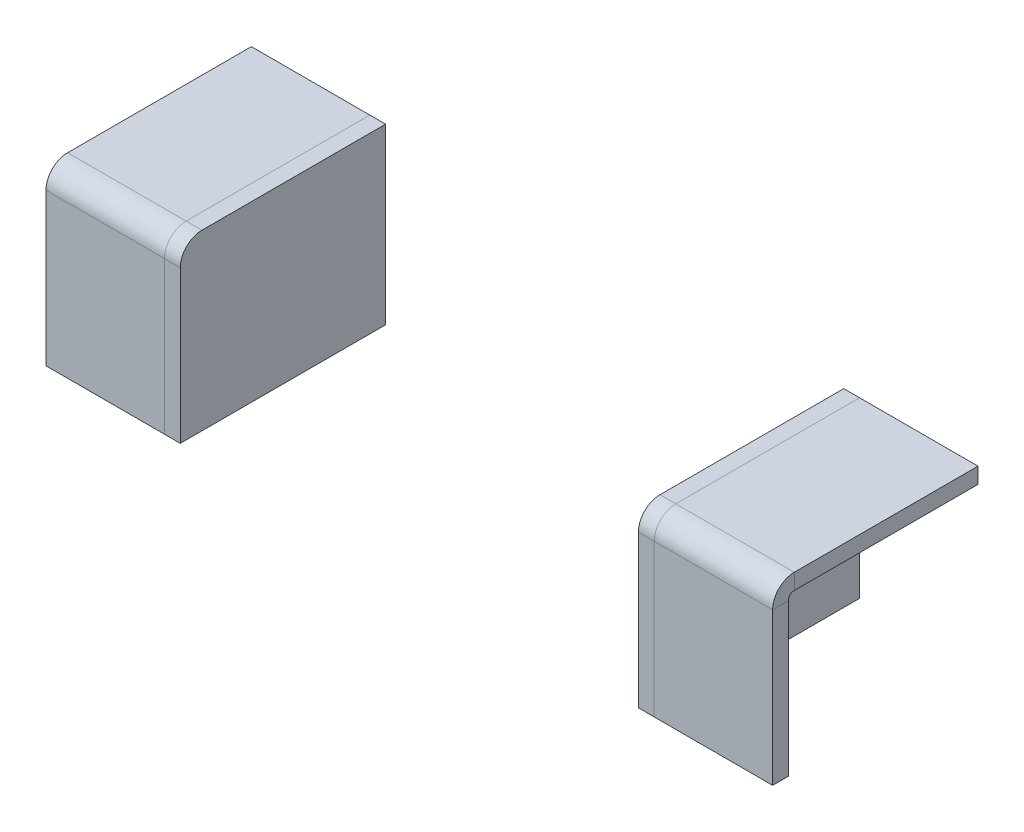
ISO-10303-21;
HEADER;
FILE_DESCRIPTION(('STEP AP214'),'2;1');
FILE_NAME('part.step','',(''),(''),'','','');
FILE_SCHEMA(('AUTOMOTIVE_DESIGN { 1 0 10303 214 1 1 1 1 }'));
ENDSEC;
DATA;
#1=APPLICATION_CONTEXT('core data for automotive mechanical design processes');
#2=APPLICATION_PROTOCOL_DEFINITION('international standard','automotive_design',2000,#1);
#3=PRODUCT_CONTEXT('',#1,'mechanical');
#4=PRODUCT('Part','Part','',(#3));
#5=PRODUCT_RELATED_PRODUCT_CATEGORY('part','',(#4));
#6=PRODUCT_DEFINITION_FORMATION('','',#4);
#7=PRODUCT_DEFINITION_CONTEXT('part definition',#1,'design');
#8=PRODUCT_DEFINITION('design','',#6,#7);
#9=PRODUCT_DEFINITION_SHAPE('','',#8);
#10=(LENGTH_UNIT() NAMED_UNIT(*) SI_UNIT(.MILLI.,.METRE.));
#11=(NAMED_UNIT(*) PLANE_ANGLE_UNIT() SI_UNIT($,.RADIAN.));
#12=(NAMED_UNIT(*) SI_UNIT($,.STERADIAN.) SOLID_ANGLE_UNIT());
#13=UNCERTAINTY_MEASURE_WITH_UNIT(LENGTH_MEASURE(1.E-05),#10,'distance_accuracy_value','');
#14=(GEOMETRIC_REPRESENTATION_CONTEXT(3) GLOBAL_UNCERTAINTY_ASSIGNED_CONTEXT((#13)) GLOBAL_UNIT_ASSIGNED_CONTEXT((#10,
#11,#12)) REPRESENTATION_CONTEXT('',''));
#15=CARTESIAN_POINT('',(0.,0.,0.));
#16=DIRECTION('',(0.,0.,1.));
#17=DIRECTION('',(1.,0.,0.));
#18=AXIS2_PLACEMENT_3D('',#15,#16,#17);
#19=CARTESIAN_POINT('',(67.5,-22.,13.0000000000001));
#20=DIRECTION('',(0.,1.,0.));
#21=DIRECTION('',(0.,0.,1.));
#22=AXIS2_PLACEMENT_3D('',#19,#20,#21);
#23=PLANE('',#22);
#24=DIRECTION('',(0.,0.,-1.));
#25=VECTOR('',#24,1.);
#26=CARTESIAN_POINT('',(69.5,-22.,13.0000000000001));
#27=LINE('',#26,#25);
#28=CARTESIAN_POINT('',(69.5,-22.,13.0000000000001));
#29=VERTEX_POINT('',#28);
#30=CARTESIAN_POINT('',(69.5,-22.,-13.));
#31=VERTEX_POINT('',#30);
#32=EDGE_CURVE('E146',#29,#31,#27,.T.);
#33=ORIENTED_EDGE('',*,*,#32,.F.);
#34=DIRECTION('',(1.,0.,0.));
#35=VECTOR('',#34,1.);
#36=CARTESIAN_POINT('',(67.5,-22.,13.0000000000001));
#37=LINE('',#36,#35);
#38=CARTESIAN_POINT('',(67.5,-22.,13.0000000000001));
#39=VERTEX_POINT('',#38);
#40=EDGE_CURVE('E145',#39,#29,#37,.T.);
#41=ORIENTED_EDGE('',*,*,#40,.F.);
#42=DIRECTION('',(0.,0.,-1.));
#43=VECTOR('',#42,1.);
#44=CARTESIAN_POINT('',(67.5,-22.,13.0000000000001));
#45=LINE('',#44,#43);
#46=CARTESIAN_POINT('',(67.5,-22.,-13.));
#47=VERTEX_POINT('',#46);
#48=EDGE_CURVE('E140',#39,#47,#45,.T.);
#49=ORIENTED_EDGE('',*,*,#48,.T.);
#50=DIRECTION('',(1.,0.,0.));
#51=VECTOR('',#50,1.);
#52=CARTESIAN_POINT('',(67.5,-22.,-13.));
#53=LINE('',#52,#51);
#54=EDGE_CURVE('E14',#47,#31,#53,.T.);
#55=ORIENTED_EDGE('',*,*,#54,.T.);
#56=EDGE_LOOP('',(#33,#41,#49,#55));
#57=FACE_BOUND('',#56,.T.);
#58=ADVANCED_FACE('F71',(#57),#23,.F.);
#59=CARTESIAN_POINT('',(67.5,-22.,-13.));
#60=DIRECTION('',(0.,0.,1.));
#61=DIRECTION('',(-1.,0.,0.));
#62=AXIS2_PLACEMENT_3D('',#59,#60,#61);
#63=PLANE('',#62);
#64=DIRECTION('',(0.,1.,0.));
#65=VECTOR('',#64,1.);
#66=CARTESIAN_POINT('',(69.5,-22.,-13.));
#67=LINE('',#66,#65);
#68=CARTESIAN_POINT('',(69.5,0.,-13.));
#69=VERTEX_POINT('',#68);
#70=EDGE_CURVE('E148',#31,#69,#67,.T.);
#71=ORIENTED_EDGE('',*,*,#70,.F.);
#72=ORIENTED_EDGE('',*,*,#54,.F.);
#73=DIRECTION('',(0.,1.,0.));
#74=VECTOR('',#73,1.);
#75=CARTESIAN_POINT('',(67.5,-22.,-13.));
#76=LINE('',#75,#74);
#77=CARTESIAN_POINT('',(67.5,0.,-13.));
#78=VERTEX_POINT('',#77);
#79=EDGE_CURVE('E116',#47,#78,#76,.T.);
#80=ORIENTED_EDGE('',*,*,#79,.T.);
#81=DIRECTION('',(1.,0.,0.));
#82=VECTOR('',#81,1.);
#83=CARTESIAN_POINT('',(67.5,0.,-13.));
#84=LINE('',#83,#82);
#85=EDGE_CURVE('E79',#78,#69,#84,.T.);
#86=ORIENTED_EDGE('',*,*,#85,.T.);
#87=EDGE_LOOP('',(#71,#72,#80,#86));
#88=FACE_BOUND('',#87,.T.);
#89=ADVANCED_FACE('F157',(#88),#63,.F.);
#90=CARTESIAN_POINT('',(67.5,0.,10.2634));
#91=DIRECTION('',(0.,-1.,0.));
#92=DIRECTION('',(0.,0.,-1.));
#93=AXIS2_PLACEMENT_3D('',#90,#91,#92);
#94=PLANE('',#93);
#95=DIRECTION('',(0.,0.,1.));
#96=VECTOR('',#95,1.);
#97=CARTESIAN_POINT('',(69.5,0.,10.2634));
#98=LINE('',#97,#96);
#99=CARTESIAN_POINT('',(69.5,0.,10.2634));
#100=VERTEX_POINT('',#99);
#101=EDGE_CURVE('E151',#69,#100,#98,.T.);
#102=ORIENTED_EDGE('',*,*,#101,.F.);
#103=ORIENTED_EDGE('',*,*,#85,.F.);
#104=DIRECTION('',(0.,0.,1.));
#105=VECTOR('',#104,1.);
#106=CARTESIAN_POINT('',(67.5,0.,10.2634));
#107=LINE('',#106,#105);
#108=CARTESIAN_POINT('',(67.5,0.,10.2634));
#109=VERTEX_POINT('',#108);
#110=EDGE_CURVE('E125',#78,#109,#107,.T.);
#111=ORIENTED_EDGE('',*,*,#110,.T.);
#112=DIRECTION('',(1.,0.,0.));
#113=VECTOR('',#112,1.);
#114=CARTESIAN_POINT('',(67.5,0.,10.2634));
#115=LINE('',#114,#113);
#116=EDGE_CURVE('E130',#109,#100,#115,.T.);
#117=ORIENTED_EDGE('',*,*,#116,.T.);
#118=EDGE_LOOP('',(#102,#103,#111,#117));
#119=FACE_BOUND('',#118,.T.);
#120=ADVANCED_FACE('F137',(#119),#94,.F.);
#121=CARTESIAN_POINT('',(67.5,-2.7366,10.2634));
#122=DIRECTION('',(1.,0.,0.));
#123=DIRECTION('',(0.,0.,1.));
#124=AXIS2_PLACEMENT_3D('',#121,#122,#123);
#125=CYLINDRICAL_SURFACE('',#124,2.7366);
#126=CARTESIAN_POINT('',(69.5,-2.7366,10.2634));
#127=DIRECTION('',(1.,0.,0.));
#128=DIRECTION('',(0.,0.,-1.));
#129=AXIS2_PLACEMENT_3D('',#126,#127,#128);
#130=CIRCLE('',#129,2.7366);
#131=CARTESIAN_POINT('',(69.5,-2.73659999999999,13.));
#132=VERTEX_POINT('',#131);
#133=EDGE_CURVE('E132',#100,#132,#130,.T.);
#134=ORIENTED_EDGE('',*,*,#133,.F.);
#135=ORIENTED_EDGE('',*,*,#116,.F.);
#136=CARTESIAN_POINT('',(67.5,-2.7366,10.2634));
#137=DIRECTION('',(1.,0.,0.));
#138=DIRECTION('',(0.,0.,-1.));
#139=AXIS2_PLACEMENT_3D('',#136,#137,#138);
#140=CIRCLE('',#139,2.7366);
#141=CARTESIAN_POINT('',(67.5,-2.73659999999999,13.));
#142=VERTEX_POINT('',#141);
#143=EDGE_CURVE('E121',#109,#142,#140,.T.);
#144=ORIENTED_EDGE('',*,*,#143,.T.);
#145=DIRECTION('',(1.,0.,0.));
#146=VECTOR('',#145,1.);
#147=CARTESIAN_POINT('',(67.5,-2.73659999999999,13.));
#148=LINE('',#147,#146);
#149=EDGE_CURVE('E135',#142,#132,#148,.T.);
#150=ORIENTED_EDGE('',*,*,#149,.T.);
#151=EDGE_LOOP('',(#134,#135,#144,#150));
#152=FACE_BOUND('',#151,.T.);
#153=ADVANCED_FACE('F131',(#152),#125,.T.);
#154=CARTESIAN_POINT('',(67.5,-22.,13.0000000000001));
#155=DIRECTION('',(0.,0.,-1.));
#156=DIRECTION('',(0.,1.,0.));
#157=AXIS2_PLACEMENT_3D('',#154,#155,#156);
#158=PLANE('',#157);
#159=DIRECTION('',(0.,-1.,0.));
#160=VECTOR('',#159,1.);
#161=CARTESIAN_POINT('',(69.5,-22.,13.0000000000001));
#162=LINE('',#161,#160);
#163=EDGE_CURVE('E104',#132,#29,#162,.T.);
#164=ORIENTED_EDGE('',*,*,#163,.F.);
#165=ORIENTED_EDGE('',*,*,#149,.F.);
#166=DIRECTION('',(0.,-1.,0.));
#167=VECTOR('',#166,1.);
#168=CARTESIAN_POINT('',(67.5,-22.,13.0000000000001));
#169=LINE('',#168,#167);
#170=EDGE_CURVE('E87',#142,#39,#169,.T.);
#171=ORIENTED_EDGE('',*,*,#170,.T.);
#172=ORIENTED_EDGE('',*,*,#40,.T.);
#173=EDGE_LOOP('',(#164,#165,#171,#172));
#174=FACE_BOUND('',#173,.T.);
#175=ADVANCED_FACE('F163',(#174),#158,.F.);
#176=CARTESIAN_POINT('',(67.5,-2.7366,10.2634));
#177=DIRECTION('',(-1.,0.,0.));
#178=DIRECTION('',(0.,0.,-1.));
#179=AXIS2_PLACEMENT_3D('',#176,#177,#178);
#180=PLANE('',#179);
#181=ORIENTED_EDGE('',*,*,#48,.F.);
#182=ORIENTED_EDGE('',*,*,#170,.F.);
#183=ORIENTED_EDGE('',*,*,#143,.F.);
#184=ORIENTED_EDGE('',*,*,#110,.F.);
#185=ORIENTED_EDGE('',*,*,#79,.F.);
#186=EDGE_LOOP('',(#181,#182,#183,#184,#185));
#187=FACE_BOUND('',#186,.T.);
#188=ADVANCED_FACE('F123',(#187),#180,.T.);
#189=CARTESIAN_POINT('',(69.5,-2.7366,10.2634));
#190=DIRECTION('',(-1.,0.,0.));
#191=DIRECTION('',(0.,0.,-1.));
#192=AXIS2_PLACEMENT_3D('',#189,#190,#191);
#193=PLANE('',#192);
#194=ORIENTED_EDGE('',*,*,#32,.T.);
#195=ORIENTED_EDGE('',*,*,#70,.T.);
#196=ORIENTED_EDGE('',*,*,#101,.T.);
#197=ORIENTED_EDGE('',*,*,#133,.T.);
#198=ORIENTED_EDGE('',*,*,#163,.T.);
#199=EDGE_LOOP('',(#194,#195,#196,#197,#198));
#200=FACE_BOUND('',#199,.T.);
#201=ADVANCED_FACE('F158',(#200),#193,.F.);
#202=CLOSED_SHELL('',(#58,#89,#120,#153,#175,#188,#201));
#203=MANIFOLD_SOLID_BREP('B2',#202);
#204=CARTESIAN_POINT('',(84.5,-2.,13.));
#205=DIRECTION('',(1.,0.,0.));
#206=DIRECTION('',(0.,0.,1.));
#207=AXIS2_PLACEMENT_3D('',#204,#205,#206);
#208=PLANE('',#207);
#209=DIRECTION('',(0.,0.,1.));
#210=VECTOR('',#209,1.);
#211=CARTESIAN_POINT('',(84.5,-2.,13.));
#212=LINE('',#211,#210);
#213=CARTESIAN_POINT('',(84.5,-2.,-13.));
#214=VERTEX_POINT('',#213);
#215=CARTESIAN_POINT('',(84.5,-2.,10.2634));
#216=VERTEX_POINT('',#215);
#217=EDGE_CURVE('E379',#214,#216,#212,.T.);
#218=ORIENTED_EDGE('',*,*,#217,.F.);
#219=DIRECTION('',(0.,1.,0.));
#220=VECTOR('',#219,1.);
#221=CARTESIAN_POINT('',(84.5,-2.,-13.));
#222=LINE('',#221,#220);
#223=CARTESIAN_POINT('',(84.5,0.,-13.));
#224=VERTEX_POINT('',#223);
#225=EDGE_CURVE('E69',#214,#224,#222,.T.);
#226=ORIENTED_EDGE('',*,*,#225,.T.);
#227=DIRECTION('',(0.,0.,1.));
#228=VECTOR('',#227,1.);
#229=CARTESIAN_POINT('',(84.5,0.,13.));
#230=LINE('',#229,#228);
#231=CARTESIAN_POINT('',(84.5,0.,10.2634));
#232=VERTEX_POINT('',#231);
#233=EDGE_CURVE('E377',#224,#232,#230,.T.);
#234=ORIENTED_EDGE('',*,*,#233,.T.);
#235=DIRECTION('',(0.,1.,0.));
#236=VECTOR('',#235,1.);
#237=CARTESIAN_POINT('',(84.5,-2.,10.2634));
#238=LINE('',#237,#236);
#239=EDGE_CURVE('E361',#216,#232,#238,.T.);
#240=ORIENTED_EDGE('',*,*,#239,.F.);
#241=EDGE_LOOP('',(#218,#226,#234,#240));
#242=FACE_BOUND('',#241,.T.);
#243=ADVANCED_FACE('F244',(#242),#208,.T.);
#244=CARTESIAN_POINT('',(77.,-2.,0.));
#245=DIRECTION('',(0.,-1.,0.));
#246=DIRECTION('',(0.,0.,-1.));
#247=AXIS2_PLACEMENT_3D('',#244,#245,#246);
#248=PLANE('',#247);
#249=DIRECTION('',(0.,0.,-1.));
#250=VECTOR('',#249,1.);
#251=CARTESIAN_POINT('',(69.5,-2.,13.));
#252=LINE('',#251,#250);
#253=CARTESIAN_POINT('',(69.5,-2.,10.2634));
#254=VERTEX_POINT('',#253);
#255=CARTESIAN_POINT('',(69.5,-2.,-13.));
#256=VERTEX_POINT('',#255);
#257=EDGE_CURVE('E373',#254,#256,#252,.T.);
#258=ORIENTED_EDGE('',*,*,#257,.T.);
#259=DIRECTION('',(1.,0.,0.));
#260=VECTOR('',#259,1.);
#261=CARTESIAN_POINT('',(84.5,-2.,-13.));
#262=LINE('',#261,#260);
#263=EDGE_CURVE('E376',#256,#214,#262,.T.);
#264=ORIENTED_EDGE('',*,*,#263,.T.);
#265=ORIENTED_EDGE('',*,*,#217,.T.);
#266=DIRECTION('',(1.,0.,0.));
#267=VECTOR('',#266,1.);
#268=CARTESIAN_POINT('',(84.5,-2.,10.2634));
#269=LINE('',#268,#267);
#270=EDGE_CURVE('E364',#216,#254,#269,.F.);
#271=ORIENTED_EDGE('',*,*,#270,.T.);
#272=EDGE_LOOP('',(#258,#264,#265,#271));
#273=FACE_BOUND('',#272,.T.);
#274=ADVANCED_FACE('F411',(#273),#248,.T.);
#275=CARTESIAN_POINT('',(77.,0.,0.));
#276=DIRECTION('',(0.,-1.,0.));
#277=DIRECTION('',(0.,0.,-1.));
#278=AXIS2_PLACEMENT_3D('',#275,#276,#277);
#279=PLANE('',#278);
#280=DIRECTION('',(1.,0.,0.));
#281=VECTOR('',#280,1.);
#282=CARTESIAN_POINT('',(84.5,0.,10.2634));
#283=LINE('',#282,#281);
#284=CARTESIAN_POINT('',(69.5,0.,10.2634));
#285=VERTEX_POINT('',#284);
#286=EDGE_CURVE('E355',#232,#285,#283,.F.);
#287=ORIENTED_EDGE('',*,*,#286,.F.);
#288=ORIENTED_EDGE('',*,*,#233,.F.);
#289=DIRECTION('',(1.,0.,0.));
#290=VECTOR('',#289,1.);
#291=CARTESIAN_POINT('',(84.5,0.,-13.));
#292=LINE('',#291,#290);
#293=CARTESIAN_POINT('',(69.5,0.,-13.));
#294=VERTEX_POINT('',#293);
#295=EDGE_CURVE('E384',#294,#224,#292,.T.);
#296=ORIENTED_EDGE('',*,*,#295,.F.);
#297=DIRECTION('',(0.,0.,-1.));
#298=VECTOR('',#297,1.);
#299=CARTESIAN_POINT('',(69.5,0.,13.));
#300=LINE('',#299,#298);
#301=EDGE_CURVE('E371',#285,#294,#300,.T.);
#302=ORIENTED_EDGE('',*,*,#301,.F.);
#303=EDGE_LOOP('',(#287,#288,#296,#302));
#304=FACE_BOUND('',#303,.T.);
#305=ADVANCED_FACE('F395',(#304),#279,.F.);
#306=CARTESIAN_POINT('',(69.5,-2.,13.));
#307=DIRECTION('',(-1.,0.,0.));
#308=DIRECTION('',(0.,0.,-1.));
#309=AXIS2_PLACEMENT_3D('',#306,#307,#308);
#310=PLANE('',#309);
#311=DIRECTION('',(0.,1.,0.));
#312=VECTOR('',#311,1.);
#313=CARTESIAN_POINT('',(69.5,-2.,10.2634));
#314=LINE('',#313,#312);
#315=EDGE_CURVE('E368',#254,#285,#314,.T.);
#316=ORIENTED_EDGE('',*,*,#315,.T.);
#317=ORIENTED_EDGE('',*,*,#301,.T.);
#318=DIRECTION('',(0.,1.,0.));
#319=VECTOR('',#318,1.);
#320=CARTESIAN_POINT('',(69.5,-2.,-13.));
#321=LINE('',#320,#319);
#322=EDGE_CURVE('E248',#256,#294,#321,.T.);
#323=ORIENTED_EDGE('',*,*,#322,.F.);
#324=ORIENTED_EDGE('',*,*,#257,.F.);
#325=EDGE_LOOP('',(#316,#317,#323,#324));
#326=FACE_BOUND('',#325,.T.);
#327=ADVANCED_FACE('F246',(#326),#310,.T.);
#328=CARTESIAN_POINT('',(84.5,-2.,-13.));
#329=DIRECTION('',(0.,0.,-1.));
#330=DIRECTION('',(1.,0.,0.));
#331=AXIS2_PLACEMENT_3D('',#328,#329,#330);
#332=PLANE('',#331);
#333=ORIENTED_EDGE('',*,*,#295,.T.);
#334=ORIENTED_EDGE('',*,*,#225,.F.);
#335=ORIENTED_EDGE('',*,*,#263,.F.);
#336=ORIENTED_EDGE('',*,*,#322,.T.);
#337=EDGE_LOOP('',(#333,#334,#335,#336));
#338=FACE_BOUND('',#337,.T.);
#339=ADVANCED_FACE('F414',(#338),#332,.T.);
#340=CARTESIAN_POINT('',(69.5,-2.7366,10.2634));
#341=DIRECTION('',(-1.,0.,0.));
#342=DIRECTION('',(0.,0.,-1.));
#343=AXIS2_PLACEMENT_3D('',#340,#341,#342);
#344=PLANE('',#343);
#345=DIRECTION('',(0.,0.,-1.));
#346=VECTOR('',#345,1.);
#347=CARTESIAN_POINT('',(69.5,-2.7366,13.));
#348=LINE('',#347,#346);
#349=CARTESIAN_POINT('',(69.5,-2.73659999999999,11.));
#350=VERTEX_POINT('',#349);
#351=CARTESIAN_POINT('',(69.5,-2.73659999999999,13.));
#352=VERTEX_POINT('',#351);
#353=EDGE_CURVE('E352',#350,#352,#348,.F.);
#354=ORIENTED_EDGE('',*,*,#353,.T.);
#355=CARTESIAN_POINT('',(69.5,-2.7366,10.2634));
#356=DIRECTION('',(-1.,0.,0.));
#357=DIRECTION('',(0.,0.,1.));
#358=AXIS2_PLACEMENT_3D('',#355,#356,#357);
#359=CIRCLE('',#358,2.7366);
#360=EDGE_CURVE('E358',#285,#352,#359,.F.);
#361=ORIENTED_EDGE('',*,*,#360,.F.);
#362=ORIENTED_EDGE('',*,*,#315,.F.);
#363=CARTESIAN_POINT('',(69.5,-2.7366,10.2634));
#364=DIRECTION('',(-1.,0.,0.));
#365=DIRECTION('',(0.,0.,1.));
#366=AXIS2_PLACEMENT_3D('',#363,#364,#365);
#367=CIRCLE('',#366,0.7366);
#368=EDGE_CURVE('E266',#254,#350,#367,.F.);
#369=ORIENTED_EDGE('',*,*,#368,.T.);
#370=EDGE_LOOP('',(#354,#361,#362,#369));
#371=FACE_BOUND('',#370,.T.);
#372=ADVANCED_FACE('F407',(#371),#344,.T.);
#373=CARTESIAN_POINT('',(84.5,-2.7366,10.2634));
#374=DIRECTION('',(-1.,0.,0.));
#375=DIRECTION('',(0.,0.,-1.));
#376=AXIS2_PLACEMENT_3D('',#373,#374,#375);
#377=PLANE('',#376);
#378=CARTESIAN_POINT('',(84.5,-2.7366,10.2634));
#379=DIRECTION('',(-1.,0.,0.));
#380=DIRECTION('',(0.,0.,1.));
#381=AXIS2_PLACEMENT_3D('',#378,#379,#380);
#382=CIRCLE('',#381,0.7366);
#383=CARTESIAN_POINT('',(84.5,-2.73659999999999,11.));
#384=VERTEX_POINT('',#383);
#385=EDGE_CURVE('E259',#384,#216,#382,.T.);
#386=ORIENTED_EDGE('',*,*,#385,.T.);
#387=ORIENTED_EDGE('',*,*,#239,.T.);
#388=CARTESIAN_POINT('',(84.5,-2.7366,10.2634));
#389=DIRECTION('',(-1.,0.,0.));
#390=DIRECTION('',(0.,0.,1.));
#391=AXIS2_PLACEMENT_3D('',#388,#389,#390);
#392=CIRCLE('',#391,2.7366);
#393=CARTESIAN_POINT('',(84.5,-2.7366,13.));
#394=VERTEX_POINT('',#393);
#395=EDGE_CURVE('E359',#394,#232,#392,.T.);
#396=ORIENTED_EDGE('',*,*,#395,.F.);
#397=DIRECTION('',(0.,0.,-1.));
#398=VECTOR('',#397,1.);
#399=CARTESIAN_POINT('',(84.5,-2.7366,11.));
#400=LINE('',#399,#398);
#401=EDGE_CURVE('E346',#384,#394,#400,.F.);
#402=ORIENTED_EDGE('',*,*,#401,.F.);
#403=EDGE_LOOP('',(#386,#387,#396,#402));
#404=FACE_BOUND('',#403,.T.);
#405=ADVANCED_FACE('F399',(#404),#377,.F.);
#406=CARTESIAN_POINT('',(84.5,-2.7366,10.2634));
#407=DIRECTION('',(1.,0.,0.));
#408=DIRECTION('',(0.,0.,1.));
#409=AXIS2_PLACEMENT_3D('',#406,#407,#408);
#410=CYLINDRICAL_SURFACE('',#409,2.7366);
#411=ORIENTED_EDGE('',*,*,#286,.T.);
#412=ORIENTED_EDGE('',*,*,#360,.T.);
#413=DIRECTION('',(1.,0.,0.));
#414=VECTOR('',#413,1.);
#415=CARTESIAN_POINT('',(69.5,-2.7366,13.));
#416=LINE('',#415,#414);
#417=EDGE_CURVE('E328',#394,#352,#416,.F.);
#418=ORIENTED_EDGE('',*,*,#417,.F.);
#419=ORIENTED_EDGE('',*,*,#395,.T.);
#420=EDGE_LOOP('',(#411,#412,#418,#419));
#421=FACE_BOUND('',#420,.T.);
#422=ADVANCED_FACE('F400',(#421),#410,.T.);
#423=CARTESIAN_POINT('',(84.5,-2.7366,10.2634));
#424=DIRECTION('',(1.,0.,0.));
#425=DIRECTION('',(0.,0.,1.));
#426=AXIS2_PLACEMENT_3D('',#423,#424,#425);
#427=CYLINDRICAL_SURFACE('',#426,0.7366);
#428=ORIENTED_EDGE('',*,*,#270,.F.);
#429=ORIENTED_EDGE('',*,*,#385,.F.);
#430=DIRECTION('',(1.,0.,0.));
#431=VECTOR('',#430,1.);
#432=CARTESIAN_POINT('',(69.5,-2.7366,11.));
#433=LINE('',#432,#431);
#434=EDGE_CURVE('E349',#350,#384,#433,.T.);
#435=ORIENTED_EDGE('',*,*,#434,.F.);
#436=ORIENTED_EDGE('',*,*,#368,.F.);
#437=EDGE_LOOP('',(#428,#429,#435,#436));
#438=FACE_BOUND('',#437,.T.);
#439=ADVANCED_FACE('F405',(#438),#427,.F.);
#440=CARTESIAN_POINT('',(84.5,-22.,13.0000000000001));
#441=DIRECTION('',(-1.,0.,0.));
#442=DIRECTION('',(0.,1.,0.));
#443=AXIS2_PLACEMENT_3D('',#440,#441,#442);
#444=PLANE('',#443);
#445=ORIENTED_EDGE('',*,*,#401,.T.);
#446=DIRECTION('',(0.,-1.,0.));
#447=VECTOR('',#446,1.);
#448=CARTESIAN_POINT('',(84.5,0.,13.));
#449=LINE('',#448,#447);
#450=CARTESIAN_POINT('',(84.5,-22.,13.0000000000001));
#451=VERTEX_POINT('',#450);
#452=EDGE_CURVE('E323',#394,#451,#449,.T.);
#453=ORIENTED_EDGE('',*,*,#452,.T.);
#454=DIRECTION('',(0.,0.,-1.));
#455=VECTOR('',#454,1.);
#456=CARTESIAN_POINT('',(84.5,-22.,13.0000000000001));
#457=LINE('',#456,#455);
#458=CARTESIAN_POINT('',(84.5,-22.,11.0000000000001));
#459=VERTEX_POINT('',#458);
#460=EDGE_CURVE('E319',#451,#459,#457,.T.);
#461=ORIENTED_EDGE('',*,*,#460,.T.);
#462=DIRECTION('',(0.,1.,0.));
#463=VECTOR('',#462,1.);
#464=CARTESIAN_POINT('',(84.5,-22.,11.0000000000001));
#465=LINE('',#464,#463);
#466=EDGE_CURVE('E342',#384,#459,#465,.F.);
#467=ORIENTED_EDGE('',*,*,#466,.F.);
#468=EDGE_LOOP('',(#445,#453,#461,#467));
#469=FACE_BOUND('',#468,.T.);
#470=ADVANCED_FACE('F402',(#469),#444,.F.);
#471=CARTESIAN_POINT('',(69.5,-1.99999999999999,13.));
#472=DIRECTION('',(1.,0.,0.));
#473=DIRECTION('',(0.,0.,1.));
#474=AXIS2_PLACEMENT_3D('',#471,#472,#473);
#475=PLANE('',#474);
#476=ORIENTED_EDGE('',*,*,#353,.F.);
#477=DIRECTION('',(0.,-1.,0.));
#478=VECTOR('',#477,1.);
#479=CARTESIAN_POINT('',(69.5,-2.,11.));
#480=LINE('',#479,#478);
#481=CARTESIAN_POINT('',(69.5,-22.,11.0000000000001));
#482=VERTEX_POINT('',#481);
#483=EDGE_CURVE('E334',#482,#350,#480,.F.);
#484=ORIENTED_EDGE('',*,*,#483,.F.);
#485=DIRECTION('',(0.,0.,-1.));
#486=VECTOR('',#485,1.);
#487=CARTESIAN_POINT('',(69.5,-22.,13.0000000000001));
#488=LINE('',#487,#486);
#489=CARTESIAN_POINT('',(69.5,-22.,13.0000000000001));
#490=VERTEX_POINT('',#489);
#491=EDGE_CURVE('E316',#490,#482,#488,.T.);
#492=ORIENTED_EDGE('',*,*,#491,.F.);
#493=DIRECTION('',(0.,1.,0.));
#494=VECTOR('',#493,1.);
#495=CARTESIAN_POINT('',(69.5,0.,13.));
#496=LINE('',#495,#494);
#497=EDGE_CURVE('E322',#490,#352,#496,.T.);
#498=ORIENTED_EDGE('',*,*,#497,.T.);
#499=EDGE_LOOP('',(#476,#484,#492,#498));
#500=FACE_BOUND('',#499,.T.);
#501=ADVANCED_FACE('F333',(#500),#475,.F.);
#502=CARTESIAN_POINT('',(77.,0.,13.));
#503=DIRECTION('',(0.,0.,-1.));
#504=DIRECTION('',(0.,1.,0.));
#505=AXIS2_PLACEMENT_3D('',#502,#503,#504);
#506=PLANE('',#505);
#507=ORIENTED_EDGE('',*,*,#417,.T.);
#508=ORIENTED_EDGE('',*,*,#497,.F.);
#509=DIRECTION('',(-1.,0.,0.));
#510=VECTOR('',#509,1.);
#511=CARTESIAN_POINT('',(77.,-22.,13.0000000000001));
#512=LINE('',#511,#510);
#513=EDGE_CURVE('E312',#451,#490,#512,.T.);
#514=ORIENTED_EDGE('',*,*,#513,.F.);
#515=ORIENTED_EDGE('',*,*,#452,.F.);
#516=EDGE_LOOP('',(#507,#508,#514,#515));
#517=FACE_BOUND('',#516,.T.);
#518=ADVANCED_FACE('F326',(#517),#506,.F.);
#519=CARTESIAN_POINT('',(77.,0.,11.));
#520=DIRECTION('',(0.,0.,-1.));
#521=DIRECTION('',(0.,1.,0.));
#522=AXIS2_PLACEMENT_3D('',#519,#520,#521);
#523=PLANE('',#522);
#524=ORIENTED_EDGE('',*,*,#466,.T.);
#525=DIRECTION('',(1.,0.,0.));
#526=VECTOR('',#525,1.);
#527=CARTESIAN_POINT('',(69.5,-22.,11.0000000000001));
#528=LINE('',#527,#526);
#529=EDGE_CURVE('E340',#459,#482,#528,.F.);
#530=ORIENTED_EDGE('',*,*,#529,.T.);
#531=ORIENTED_EDGE('',*,*,#483,.T.);
#532=ORIENTED_EDGE('',*,*,#434,.T.);
#533=EDGE_LOOP('',(#524,#530,#531,#532));
#534=FACE_BOUND('',#533,.T.);
#535=ADVANCED_FACE('F404',(#534),#523,.T.);
#536=CARTESIAN_POINT('',(69.5,-22.,13.0000000000001));
#537=DIRECTION('',(0.,1.,0.));
#538=DIRECTION('',(0.,0.,1.));
#539=AXIS2_PLACEMENT_3D('',#536,#537,#538);
#540=PLANE('',#539);
#541=ORIENTED_EDGE('',*,*,#529,.F.);
#542=ORIENTED_EDGE('',*,*,#460,.F.);
#543=ORIENTED_EDGE('',*,*,#513,.T.);
#544=ORIENTED_EDGE('',*,*,#491,.T.);
#545=EDGE_LOOP('',(#541,#542,#543,#544));
#546=FACE_BOUND('',#545,.T.);
#547=ADVANCED_FACE('F314',(#546),#540,.F.);
#548=CLOSED_SHELL('',(#243,#274,#305,#327,#339,#372,#405,#422,#439,#470,#501,#518,#535,#547));
#549=MANIFOLD_SOLID_BREP('B8',#548);
#550=CARTESIAN_POINT('',(9.5,-22.,13.0000000000001));
#551=DIRECTION('',(0.,1.,0.));
#552=DIRECTION('',(0.,0.,1.));
#553=AXIS2_PLACEMENT_3D('',#550,#551,#552);
#554=PLANE('',#553);
#555=DIRECTION('',(0.,0.,-1.));
#556=VECTOR('',#555,1.);
#557=CARTESIAN_POINT('',(7.5,-22.,13.0000000000001));
#558=LINE('',#557,#556);
#559=CARTESIAN_POINT('',(7.5,-22.,13.0000000000001));
#560=VERTEX_POINT('',#559);
#561=CARTESIAN_POINT('',(7.5,-22.,-13.));
#562=VERTEX_POINT('',#561);
#563=EDGE_CURVE('E638',#560,#562,#558,.T.);
#564=ORIENTED_EDGE('',*,*,#563,.T.);
#565=DIRECTION('',(-1.,0.,0.));
#566=VECTOR('',#565,1.);
#567=CARTESIAN_POINT('',(9.5,-22.,-13.));
#568=LINE('',#567,#566);
#569=CARTESIAN_POINT('',(9.5,-22.,-13.));
#570=VERTEX_POINT('',#569);
#571=EDGE_CURVE('E242',#570,#562,#568,.T.);
#572=ORIENTED_EDGE('',*,*,#571,.F.);
#573=DIRECTION('',(0.,0.,-1.));
#574=VECTOR('',#573,1.);
#575=CARTESIAN_POINT('',(9.5,-22.,13.0000000000001));
#576=LINE('',#575,#574);
#577=CARTESIAN_POINT('',(9.5,-22.,13.0000000000001));
#578=VERTEX_POINT('',#577);
#579=EDGE_CURVE('E646',#578,#570,#576,.T.);
#580=ORIENTED_EDGE('',*,*,#579,.F.);
#581=DIRECTION('',(-1.,0.,0.));
#582=VECTOR('',#581,1.);
#583=CARTESIAN_POINT('',(9.5,-22.,13.0000000000001));
#584=LINE('',#583,#582);
#585=EDGE_CURVE('E634',#578,#560,#584,.T.);
#586=ORIENTED_EDGE('',*,*,#585,.T.);
#587=EDGE_LOOP('',(#564,#572,#580,#586));
#588=FACE_BOUND('',#587,.T.);
#589=ADVANCED_FACE('F564',(#588),#554,.F.);
#590=CARTESIAN_POINT('',(9.5,-22.,-13.));
#591=DIRECTION('',(0.,0.,1.));
#592=DIRECTION('',(1.,0.,0.));
#593=AXIS2_PLACEMENT_3D('',#590,#591,#592);
#594=PLANE('',#593);
#595=DIRECTION('',(0.,1.,0.));
#596=VECTOR('',#595,1.);
#597=CARTESIAN_POINT('',(7.5,-22.,-13.));
#598=LINE('',#597,#596);
#599=CARTESIAN_POINT('',(7.5,0.,-13.));
#600=VERTEX_POINT('',#599);
#601=EDGE_CURVE('E641',#562,#600,#598,.T.);
#602=ORIENTED_EDGE('',*,*,#601,.T.);
#603=DIRECTION('',(-1.,0.,0.));
#604=VECTOR('',#603,1.);
#605=CARTESIAN_POINT('',(9.5,0.,-13.));
#606=LINE('',#605,#604);
#607=CARTESIAN_POINT('',(9.5,0.,-13.));
#608=VERTEX_POINT('',#607);
#609=EDGE_CURVE('E572',#608,#600,#606,.T.);
#610=ORIENTED_EDGE('',*,*,#609,.F.);
#611=DIRECTION('',(0.,1.,0.));
#612=VECTOR('',#611,1.);
#613=CARTESIAN_POINT('',(9.5,-22.,-13.));
#614=LINE('',#613,#612);
#615=EDGE_CURVE('E614',#570,#608,#614,.T.);
#616=ORIENTED_EDGE('',*,*,#615,.F.);
#617=ORIENTED_EDGE('',*,*,#571,.T.);
#618=EDGE_LOOP('',(#602,#610,#616,#617));
#619=FACE_BOUND('',#618,.T.);
#620=ADVANCED_FACE('F665',(#619),#594,.F.);
#621=CARTESIAN_POINT('',(9.5,0.,10.2634));
#622=DIRECTION('',(0.,-1.,0.));
#623=DIRECTION('',(0.,0.,-1.));
#624=AXIS2_PLACEMENT_3D('',#621,#622,#623);
#625=PLANE('',#624);
#626=DIRECTION('',(0.,0.,1.));
#627=VECTOR('',#626,1.);
#628=CARTESIAN_POINT('',(7.5,0.,10.2634));
#629=LINE('',#628,#627);
#630=CARTESIAN_POINT('',(7.5,0.,10.2634));
#631=VERTEX_POINT('',#630);
#632=EDGE_CURVE('E629',#600,#631,#629,.T.);
#633=ORIENTED_EDGE('',*,*,#632,.T.);
#634=DIRECTION('',(-1.,0.,0.));
#635=VECTOR('',#634,1.);
#636=CARTESIAN_POINT('',(9.5,0.,10.2634));
#637=LINE('',#636,#635);
#638=CARTESIAN_POINT('',(9.5,0.,10.2634));
#639=VERTEX_POINT('',#638);
#640=EDGE_CURVE('E626',#639,#631,#637,.T.);
#641=ORIENTED_EDGE('',*,*,#640,.F.);
#642=DIRECTION('',(0.,0.,1.));
#643=VECTOR('',#642,1.);
#644=CARTESIAN_POINT('',(9.5,0.,10.2634));
#645=LINE('',#644,#643);
#646=EDGE_CURVE('E618',#608,#639,#645,.T.);
#647=ORIENTED_EDGE('',*,*,#646,.F.);
#648=ORIENTED_EDGE('',*,*,#609,.T.);
#649=EDGE_LOOP('',(#633,#641,#647,#648));
#650=FACE_BOUND('',#649,.T.);
#651=ADVANCED_FACE('F627',(#650),#625,.F.);
#652=CARTESIAN_POINT('',(9.5,-2.7366,10.2634));
#653=DIRECTION('',(-1.,0.,0.));
#654=DIRECTION('',(0.,0.,1.));
#655=AXIS2_PLACEMENT_3D('',#652,#653,#654);
#656=CYLINDRICAL_SURFACE('',#655,2.7366);
#657=CARTESIAN_POINT('',(7.5,-2.7366,10.2634));
#658=DIRECTION('',(1.,0.,0.));
#659=DIRECTION('',(0.,0.,-1.));
#660=AXIS2_PLACEMENT_3D('',#657,#658,#659);
#661=CIRCLE('',#660,2.7366);
#662=CARTESIAN_POINT('',(7.5,-2.73659999999999,13.));
#663=VERTEX_POINT('',#662);
#664=EDGE_CURVE('E600',#631,#663,#661,.T.);
#665=ORIENTED_EDGE('',*,*,#664,.T.);
#666=DIRECTION('',(-1.,0.,0.));
#667=VECTOR('',#666,1.);
#668=CARTESIAN_POINT('',(9.5,-2.73659999999999,13.));
#669=LINE('',#668,#667);
#670=CARTESIAN_POINT('',(9.5,-2.73659999999999,13.));
#671=VERTEX_POINT('',#670);
#672=EDGE_CURVE('E630',#671,#663,#669,.T.);
#673=ORIENTED_EDGE('',*,*,#672,.F.);
#674=CARTESIAN_POINT('',(9.5,-2.7366,10.2634));
#675=DIRECTION('',(1.,0.,0.));
#676=DIRECTION('',(0.,0.,-1.));
#677=AXIS2_PLACEMENT_3D('',#674,#675,#676);
#678=CIRCLE('',#677,2.7366);
#679=EDGE_CURVE('E622',#639,#671,#678,.T.);
#680=ORIENTED_EDGE('',*,*,#679,.F.);
#681=ORIENTED_EDGE('',*,*,#640,.T.);
#682=EDGE_LOOP('',(#665,#673,#680,#681));
#683=FACE_BOUND('',#682,.T.);
#684=ADVANCED_FACE('F632',(#683),#656,.T.);
#685=CARTESIAN_POINT('',(9.5,-22.,13.0000000000001));
#686=DIRECTION('',(0.,0.,-1.));
#687=DIRECTION('',(0.,1.,0.));
#688=AXIS2_PLACEMENT_3D('',#685,#686,#687);
#689=PLANE('',#688);
#690=DIRECTION('',(0.,-1.,0.));
#691=VECTOR('',#690,1.);
#692=CARTESIAN_POINT('',(7.5,-22.,13.0000000000001));
#693=LINE('',#692,#691);
#694=EDGE_CURVE('E606',#663,#560,#693,.T.);
#695=ORIENTED_EDGE('',*,*,#694,.T.);
#696=ORIENTED_EDGE('',*,*,#585,.F.);
#697=DIRECTION('',(0.,-1.,0.));
#698=VECTOR('',#697,1.);
#699=CARTESIAN_POINT('',(9.5,-22.,13.0000000000001));
#700=LINE('',#699,#698);
#701=EDGE_CURVE('E580',#671,#578,#700,.T.);
#702=ORIENTED_EDGE('',*,*,#701,.F.);
#703=ORIENTED_EDGE('',*,*,#672,.T.);
#704=EDGE_LOOP('',(#695,#696,#702,#703));
#705=FACE_BOUND('',#704,.T.);
#706=ADVANCED_FACE('F654',(#705),#689,.F.);
#707=CARTESIAN_POINT('',(9.5,-2.7366,10.2634));
#708=DIRECTION('',(1.,0.,0.));
#709=DIRECTION('',(0.,0.,-1.));
#710=AXIS2_PLACEMENT_3D('',#707,#708,#709);
#711=PLANE('',#710);
#712=ORIENTED_EDGE('',*,*,#579,.T.);
#713=ORIENTED_EDGE('',*,*,#615,.T.);
#714=ORIENTED_EDGE('',*,*,#646,.T.);
#715=ORIENTED_EDGE('',*,*,#679,.T.);
#716=ORIENTED_EDGE('',*,*,#701,.T.);
#717=EDGE_LOOP('',(#712,#713,#714,#715,#716));
#718=FACE_BOUND('',#717,.T.);
#719=ADVANCED_FACE('F620',(#718),#711,.T.);
#720=CARTESIAN_POINT('',(7.5,-2.7366,10.2634));
#721=DIRECTION('',(1.,0.,0.));
#722=DIRECTION('',(0.,0.,-1.));
#723=AXIS2_PLACEMENT_3D('',#720,#721,#722);
#724=PLANE('',#723);
#725=ORIENTED_EDGE('',*,*,#563,.F.);
#726=ORIENTED_EDGE('',*,*,#694,.F.);
#727=ORIENTED_EDGE('',*,*,#664,.F.);
#728=ORIENTED_EDGE('',*,*,#632,.F.);
#729=ORIENTED_EDGE('',*,*,#601,.F.);
#730=EDGE_LOOP('',(#725,#726,#727,#728,#729));
#731=FACE_BOUND('',#730,.T.);
#732=ADVANCED_FACE('F650',(#731),#724,.F.);
#733=CLOSED_SHELL('',(#589,#620,#651,#684,#706,#719,#732));
#734=MANIFOLD_SOLID_BREP('B63',#733);
#735=CARTESIAN_POINT('',(-7.5,-2.,13.));
#736=DIRECTION('',(-1.,0.,0.));
#737=DIRECTION('',(0.,0.,1.));
#738=AXIS2_PLACEMENT_3D('',#735,#736,#737);
#739=PLANE('',#738);
#740=DIRECTION('',(0.,0.,1.));
#741=VECTOR('',#740,1.);
#742=CARTESIAN_POINT('',(-7.5,-2.,13.));
#743=LINE('',#742,#741);
#744=CARTESIAN_POINT('',(-7.5,-2.,-13.));
#745=VERTEX_POINT('',#744);
#746=CARTESIAN_POINT('',(-7.5,-2.,10.2634));
#747=VERTEX_POINT('',#746);
#748=EDGE_CURVE('E860',#745,#747,#743,.T.);
#749=ORIENTED_EDGE('',*,*,#748,.T.);
#750=DIRECTION('',(0.,1.,0.));
#751=VECTOR('',#750,1.);
#752=CARTESIAN_POINT('',(-7.5,-2.,10.2634));
#753=LINE('',#752,#751);
#754=CARTESIAN_POINT('',(-7.5,0.,10.2634));
#755=VERTEX_POINT('',#754);
#756=EDGE_CURVE('E841',#747,#755,#753,.T.);
#757=ORIENTED_EDGE('',*,*,#756,.T.);
#758=DIRECTION('',(0.,0.,1.));
#759=VECTOR('',#758,1.);
#760=CARTESIAN_POINT('',(-7.5,0.,13.));
#761=LINE('',#760,#759);
#762=CARTESIAN_POINT('',(-7.5,0.,-13.));
#763=VERTEX_POINT('',#762);
#764=EDGE_CURVE('E857',#763,#755,#761,.T.);
#765=ORIENTED_EDGE('',*,*,#764,.F.);
#766=DIRECTION('',(0.,1.,0.));
#767=VECTOR('',#766,1.);
#768=CARTESIAN_POINT('',(-7.5,-2.,-13.));
#769=LINE('',#768,#767);
#770=EDGE_CURVE('E562',#745,#763,#769,.T.);
#771=ORIENTED_EDGE('',*,*,#770,.F.);
#772=EDGE_LOOP('',(#749,#757,#765,#771));
#773=FACE_BOUND('',#772,.T.);
#774=ADVANCED_FACE('F727',(#773),#739,.T.);
#775=CARTESIAN_POINT('',(0.,-2.,0.));
#776=DIRECTION('',(0.,-1.,0.));
#777=DIRECTION('',(0.,0.,-1.));
#778=AXIS2_PLACEMENT_3D('',#775,#776,#777);
#779=PLANE('',#778);
#780=DIRECTION('',(0.,0.,-1.));
#781=VECTOR('',#780,1.);
#782=CARTESIAN_POINT('',(7.5,-2.,13.));
#783=LINE('',#782,#781);
#784=CARTESIAN_POINT('',(7.5,-2.,10.2634));
#785=VERTEX_POINT('',#784);
#786=CARTESIAN_POINT('',(7.5,-2.,-13.));
#787=VERTEX_POINT('',#786);
#788=EDGE_CURVE('E854',#785,#787,#783,.T.);
#789=ORIENTED_EDGE('',*,*,#788,.F.);
#790=DIRECTION('',(-1.,0.,0.));
#791=VECTOR('',#790,1.);
#792=CARTESIAN_POINT('',(-7.5,-2.,10.2634));
#793=LINE('',#792,#791);
#794=EDGE_CURVE('E742',#747,#785,#793,.F.);
#795=ORIENTED_EDGE('',*,*,#794,.F.);
#796=ORIENTED_EDGE('',*,*,#748,.F.);
#797=DIRECTION('',(-1.,0.,0.));
#798=VECTOR('',#797,1.);
#799=CARTESIAN_POINT('',(-7.5,-2.,-13.));
#800=LINE('',#799,#798);
#801=EDGE_CURVE('E856',#787,#745,#800,.T.);
#802=ORIENTED_EDGE('',*,*,#801,.F.);
#803=EDGE_LOOP('',(#789,#795,#796,#802));
#804=FACE_BOUND('',#803,.T.);
#805=ADVANCED_FACE('F903',(#804),#779,.T.);
#806=CARTESIAN_POINT('',(0.,0.,0.));
#807=DIRECTION('',(0.,-1.,0.));
#808=DIRECTION('',(0.,0.,-1.));
#809=AXIS2_PLACEMENT_3D('',#806,#807,#808);
#810=PLANE('',#809);
#811=DIRECTION('',(-1.,0.,0.));
#812=VECTOR('',#811,1.);
#813=CARTESIAN_POINT('',(-7.5,0.,10.2634));
#814=LINE('',#813,#812);
#815=CARTESIAN_POINT('',(7.5,0.,10.2634));
#816=VERTEX_POINT('',#815);
#817=EDGE_CURVE('E835',#755,#816,#814,.F.);
#818=ORIENTED_EDGE('',*,*,#817,.T.);
#819=DIRECTION('',(0.,0.,-1.));
#820=VECTOR('',#819,1.);
#821=CARTESIAN_POINT('',(7.5,0.,13.));
#822=LINE('',#821,#820);
#823=CARTESIAN_POINT('',(7.5,0.,-13.));
#824=VERTEX_POINT('',#823);
#825=EDGE_CURVE('E852',#816,#824,#822,.T.);
#826=ORIENTED_EDGE('',*,*,#825,.T.);
#827=DIRECTION('',(-1.,0.,0.));
#828=VECTOR('',#827,1.);
#829=CARTESIAN_POINT('',(-7.5,0.,-13.));
#830=LINE('',#829,#828);
#831=EDGE_CURVE('E863',#824,#763,#830,.T.);
#832=ORIENTED_EDGE('',*,*,#831,.T.);
#833=ORIENTED_EDGE('',*,*,#764,.T.);
#834=EDGE_LOOP('',(#818,#826,#832,#833));
#835=FACE_BOUND('',#834,.T.);
#836=ADVANCED_FACE('F870',(#835),#810,.F.);
#837=CARTESIAN_POINT('',(7.5,-2.,13.));
#838=DIRECTION('',(1.,0.,0.));
#839=DIRECTION('',(0.,0.,-1.));
#840=AXIS2_PLACEMENT_3D('',#837,#838,#839);
#841=PLANE('',#840);
#842=DIRECTION('',(0.,1.,0.));
#843=VECTOR('',#842,1.);
#844=CARTESIAN_POINT('',(7.5,-2.,10.2634));
#845=LINE('',#844,#843);
#846=EDGE_CURVE('E750',#785,#816,#845,.T.);
#847=ORIENTED_EDGE('',*,*,#846,.F.);
#848=ORIENTED_EDGE('',*,*,#788,.T.);
#849=DIRECTION('',(0.,1.,0.));
#850=VECTOR('',#849,1.);
#851=CARTESIAN_POINT('',(7.5,-2.,-13.));
#852=LINE('',#851,#850);
#853=EDGE_CURVE('E731',#787,#824,#852,.T.);
#854=ORIENTED_EDGE('',*,*,#853,.T.);
#855=ORIENTED_EDGE('',*,*,#825,.F.);
#856=EDGE_LOOP('',(#847,#848,#854,#855));
#857=FACE_BOUND('',#856,.T.);
#858=ADVANCED_FACE('F729',(#857),#841,.T.);
#859=CARTESIAN_POINT('',(-7.5,-2.,-13.));
#860=DIRECTION('',(0.,0.,-1.));
#861=DIRECTION('',(-1.,0.,0.));
#862=AXIS2_PLACEMENT_3D('',#859,#860,#861);
#863=PLANE('',#862);
#864=ORIENTED_EDGE('',*,*,#831,.F.);
#865=ORIENTED_EDGE('',*,*,#853,.F.);
#866=ORIENTED_EDGE('',*,*,#801,.T.);
#867=ORIENTED_EDGE('',*,*,#770,.T.);
#868=EDGE_LOOP('',(#864,#865,#866,#867));
#869=FACE_BOUND('',#868,.T.);
#870=ADVANCED_FACE('F893',(#869),#863,.T.);
#871=CARTESIAN_POINT('',(7.5,-2.7366,10.2634));
#872=DIRECTION('',(1.,0.,0.));
#873=DIRECTION('',(0.,0.,-1.));
#874=AXIS2_PLACEMENT_3D('',#871,#872,#873);
#875=PLANE('',#874);
#876=DIRECTION('',(0.,0.,-1.));
#877=VECTOR('',#876,1.);
#878=CARTESIAN_POINT('',(7.5,-2.7366,13.));
#879=LINE('',#878,#877);
#880=CARTESIAN_POINT('',(7.5,-2.73659999999999,11.));
#881=VERTEX_POINT('',#880);
#882=CARTESIAN_POINT('',(7.5,-2.73659999999999,13.));
#883=VERTEX_POINT('',#882);
#884=EDGE_CURVE('E817',#881,#883,#879,.F.);
#885=ORIENTED_EDGE('',*,*,#884,.F.);
#886=CARTESIAN_POINT('',(7.5,-2.7366,10.2634));
#887=DIRECTION('',(-1.,0.,0.));
#888=DIRECTION('',(0.,0.,1.));
#889=AXIS2_PLACEMENT_3D('',#886,#887,#888);
#890=CIRCLE('',#889,0.7366);
#891=EDGE_CURVE('E844',#785,#881,#890,.F.);
#892=ORIENTED_EDGE('',*,*,#891,.F.);
#893=ORIENTED_EDGE('',*,*,#846,.T.);
#894=CARTESIAN_POINT('',(7.5,-2.7366,10.2634));
#895=DIRECTION('',(-1.,0.,0.));
#896=DIRECTION('',(0.,0.,1.));
#897=AXIS2_PLACEMENT_3D('',#894,#895,#896);
#898=CIRCLE('',#897,2.7366);
#899=EDGE_CURVE('E837',#816,#883,#898,.F.);
#900=ORIENTED_EDGE('',*,*,#899,.T.);
#901=EDGE_LOOP('',(#885,#892,#893,#900));
#902=FACE_BOUND('',#901,.T.);
#903=ADVANCED_FACE('F891',(#902),#875,.T.);
#904=CARTESIAN_POINT('',(-7.5,-2.7366,10.2634));
#905=DIRECTION('',(1.,0.,0.));
#906=DIRECTION('',(0.,0.,-1.));
#907=AXIS2_PLACEMENT_3D('',#904,#905,#906);
#908=PLANE('',#907);
#909=CARTESIAN_POINT('',(-7.5,-2.7366,10.2634));
#910=DIRECTION('',(-1.,0.,0.));
#911=DIRECTION('',(0.,0.,1.));
#912=AXIS2_PLACEMENT_3D('',#909,#910,#911);
#913=CIRCLE('',#912,0.7366);
#914=CARTESIAN_POINT('',(-7.5,-2.73659999999999,11.));
#915=VERTEX_POINT('',#914);
#916=EDGE_CURVE('E848',#915,#747,#913,.T.);
#917=ORIENTED_EDGE('',*,*,#916,.F.);
#918=DIRECTION('',(0.,0.,-1.));
#919=VECTOR('',#918,1.);
#920=CARTESIAN_POINT('',(-7.5,-2.7366,11.));
#921=LINE('',#920,#919);
#922=CARTESIAN_POINT('',(-7.5,-2.7366,13.));
#923=VERTEX_POINT('',#922);
#924=EDGE_CURVE('E829',#915,#923,#921,.F.);
#925=ORIENTED_EDGE('',*,*,#924,.T.);
#926=CARTESIAN_POINT('',(-7.5,-2.7366,10.2634));
#927=DIRECTION('',(-1.,0.,0.));
#928=DIRECTION('',(0.,0.,1.));
#929=AXIS2_PLACEMENT_3D('',#926,#927,#928);
#930=CIRCLE('',#929,2.7366);
#931=EDGE_CURVE('E838',#923,#755,#930,.T.);
#932=ORIENTED_EDGE('',*,*,#931,.T.);
#933=ORIENTED_EDGE('',*,*,#756,.F.);
#934=EDGE_LOOP('',(#917,#925,#932,#933));
#935=FACE_BOUND('',#934,.T.);
#936=ADVANCED_FACE('F879',(#935),#908,.F.);
#937=CARTESIAN_POINT('',(-7.5,-2.7366,10.2634));
#938=DIRECTION('',(-1.,0.,0.));
#939=DIRECTION('',(0.,0.,1.));
#940=AXIS2_PLACEMENT_3D('',#937,#938,#939);
#941=CYLINDRICAL_SURFACE('',#940,2.7366);
#942=ORIENTED_EDGE('',*,*,#817,.F.);
#943=ORIENTED_EDGE('',*,*,#931,.F.);
#944=DIRECTION('',(-1.,0.,0.));
#945=VECTOR('',#944,1.);
#946=CARTESIAN_POINT('',(7.5,-2.7366,13.));
#947=LINE('',#946,#945);
#948=EDGE_CURVE('E827',#923,#883,#947,.F.);
#949=ORIENTED_EDGE('',*,*,#948,.T.);
#950=ORIENTED_EDGE('',*,*,#899,.F.);
#951=EDGE_LOOP('',(#942,#943,#949,#950));
#952=FACE_BOUND('',#951,.T.);
#953=ADVANCED_FACE('F875',(#952),#941,.T.);
#954=CARTESIAN_POINT('',(-7.5,-2.7366,10.2634));
#955=DIRECTION('',(-1.,0.,0.));
#956=DIRECTION('',(0.,0.,1.));
#957=AXIS2_PLACEMENT_3D('',#954,#955,#956);
#958=CYLINDRICAL_SURFACE('',#957,0.7366);
#959=ORIENTED_EDGE('',*,*,#794,.T.);
#960=ORIENTED_EDGE('',*,*,#891,.T.);
#961=DIRECTION('',(-1.,0.,0.));
#962=VECTOR('',#961,1.);
#963=CARTESIAN_POINT('',(7.5,-2.7366,11.));
#964=LINE('',#963,#962);
#965=EDGE_CURVE('E832',#881,#915,#964,.T.);
#966=ORIENTED_EDGE('',*,*,#965,.T.);
#967=ORIENTED_EDGE('',*,*,#916,.T.);
#968=EDGE_LOOP('',(#959,#960,#966,#967));
#969=FACE_BOUND('',#968,.T.);
#970=ADVANCED_FACE('F888',(#969),#958,.F.);
#971=CARTESIAN_POINT('',(-7.5,-22.,13.0000000000001));
#972=DIRECTION('',(1.,0.,0.));
#973=DIRECTION('',(0.,1.,0.));
#974=AXIS2_PLACEMENT_3D('',#971,#972,#973);
#975=PLANE('',#974);
#976=ORIENTED_EDGE('',*,*,#924,.F.);
#977=DIRECTION('',(0.,1.,0.));
#978=VECTOR('',#977,1.);
#979=CARTESIAN_POINT('',(-7.5,-22.,11.0000000000001));
#980=LINE('',#979,#978);
#981=CARTESIAN_POINT('',(-7.5,-22.,11.0000000000001));
#982=VERTEX_POINT('',#981);
#983=EDGE_CURVE('E825',#915,#982,#980,.F.);
#984=ORIENTED_EDGE('',*,*,#983,.T.);
#985=DIRECTION('',(0.,0.,-1.));
#986=VECTOR('',#985,1.);
#987=CARTESIAN_POINT('',(-7.5,-22.,13.0000000000001));
#988=LINE('',#987,#986);
#989=CARTESIAN_POINT('',(-7.5,-22.,13.0000000000001));
#990=VERTEX_POINT('',#989);
#991=EDGE_CURVE('E813',#990,#982,#988,.T.);
#992=ORIENTED_EDGE('',*,*,#991,.F.);
#993=DIRECTION('',(0.,-1.,0.));
#994=VECTOR('',#993,1.);
#995=CARTESIAN_POINT('',(-7.5,0.,13.));
#996=LINE('',#995,#994);
#997=EDGE_CURVE('E800',#923,#990,#996,.T.);
#998=ORIENTED_EDGE('',*,*,#997,.F.);
#999=EDGE_LOOP('',(#976,#984,#992,#998));
#1000=FACE_BOUND('',#999,.T.);
#1001=ADVANCED_FACE('F883',(#1000),#975,.F.);
#1002=CARTESIAN_POINT('',(7.5,-1.99999999999999,13.));
#1003=DIRECTION('',(-1.,0.,0.));
#1004=DIRECTION('',(0.,0.,1.));
#1005=AXIS2_PLACEMENT_3D('',#1002,#1003,#1004);
#1006=PLANE('',#1005);
#1007=ORIENTED_EDGE('',*,*,#884,.T.);
#1008=DIRECTION('',(0.,1.,0.));
#1009=VECTOR('',#1008,1.);
#1010=CARTESIAN_POINT('',(7.5,0.,13.));
#1011=LINE('',#1010,#1009);
#1012=CARTESIAN_POINT('',(7.5,-22.,13.0000000000001));
#1013=VERTEX_POINT('',#1012);
#1014=EDGE_CURVE('E798',#1013,#883,#1011,.T.);
#1015=ORIENTED_EDGE('',*,*,#1014,.F.);
#1016=DIRECTION('',(0.,0.,-1.));
#1017=VECTOR('',#1016,1.);
#1018=CARTESIAN_POINT('',(7.5,-22.,13.0000000000001));
#1019=LINE('',#1018,#1017);
#1020=CARTESIAN_POINT('',(7.5,-22.,11.0000000000001));
#1021=VERTEX_POINT('',#1020);
#1022=EDGE_CURVE('E806',#1013,#1021,#1019,.T.);
#1023=ORIENTED_EDGE('',*,*,#1022,.T.);
#1024=DIRECTION('',(0.,-1.,0.));
#1025=VECTOR('',#1024,1.);
#1026=CARTESIAN_POINT('',(7.5,-2.,11.));
#1027=LINE('',#1026,#1025);
#1028=EDGE_CURVE('E822',#1021,#881,#1027,.F.);
#1029=ORIENTED_EDGE('',*,*,#1028,.T.);
#1030=EDGE_LOOP('',(#1007,#1015,#1023,#1029));
#1031=FACE_BOUND('',#1030,.T.);
#1032=ADVANCED_FACE('F816',(#1031),#1006,.F.);
#1033=CARTESIAN_POINT('',(0.,0.,13.));
#1034=DIRECTION('',(0.,0.,-1.));
#1035=DIRECTION('',(0.,1.,0.));
#1036=AXIS2_PLACEMENT_3D('',#1033,#1034,#1035);
#1037=PLANE('',#1036);
#1038=ORIENTED_EDGE('',*,*,#948,.F.);
#1039=ORIENTED_EDGE('',*,*,#997,.T.);
#1040=DIRECTION('',(1.,0.,0.));
#1041=VECTOR('',#1040,1.);
#1042=CARTESIAN_POINT('',(0.,-22.,13.0000000000001));
#1043=LINE('',#1042,#1041);
#1044=EDGE_CURVE('E793',#990,#1013,#1043,.T.);
#1045=ORIENTED_EDGE('',*,*,#1044,.T.);
#1046=ORIENTED_EDGE('',*,*,#1014,.T.);
#1047=EDGE_LOOP('',(#1038,#1039,#1045,#1046));
#1048=FACE_BOUND('',#1047,.T.);
#1049=ADVANCED_FACE('F796',(#1048),#1037,.F.);
#1050=CARTESIAN_POINT('',(0.,0.,11.));
#1051=DIRECTION('',(0.,0.,-1.));
#1052=DIRECTION('',(0.,1.,0.));
#1053=AXIS2_PLACEMENT_3D('',#1050,#1051,#1052);
#1054=PLANE('',#1053);
#1055=ORIENTED_EDGE('',*,*,#983,.F.);
#1056=ORIENTED_EDGE('',*,*,#965,.F.);
#1057=ORIENTED_EDGE('',*,*,#1028,.F.);
#1058=DIRECTION('',(-1.,0.,0.));
#1059=VECTOR('',#1058,1.);
#1060=CARTESIAN_POINT('',(7.5,-22.,11.0000000000001));
#1061=LINE('',#1060,#1059);
#1062=EDGE_CURVE('E809',#982,#1021,#1061,.F.);
#1063=ORIENTED_EDGE('',*,*,#1062,.F.);
#1064=EDGE_LOOP('',(#1055,#1056,#1057,#1063));
#1065=FACE_BOUND('',#1064,.T.);
#1066=ADVANCED_FACE('F886',(#1065),#1054,.T.);
#1067=CARTESIAN_POINT('',(7.5,-22.,13.0000000000001));
#1068=DIRECTION('',(0.,1.,0.));
#1069=DIRECTION('',(0.,0.,1.));
#1070=AXIS2_PLACEMENT_3D('',#1067,#1068,#1069);
#1071=PLANE('',#1070);
#1072=ORIENTED_EDGE('',*,*,#1062,.T.);
#1073=ORIENTED_EDGE('',*,*,#1022,.F.);
#1074=ORIENTED_EDGE('',*,*,#1044,.F.);
#1075=ORIENTED_EDGE('',*,*,#991,.T.);
#1076=EDGE_LOOP('',(#1072,#1073,#1074,#1075));
#1077=FACE_BOUND('',#1076,.T.);
#1078=ADVANCED_FACE('F807',(#1077),#1071,.F.);
#1079=CLOSED_SHELL('',(#774,#805,#836,#858,#870,#903,#936,#953,#970,#1001,#1032,#1049,#1066,#1078));
#1080=MANIFOLD_SOLID_BREP('B236',#1079);
#1081=ADVANCED_BREP_SHAPE_REPRESENTATION('',(#18,#203,#549,#734,#1080),#14);
#1082=SHAPE_DEFINITION_REPRESENTATION(#9,#1081);
ENDSEC;
END-ISO-10303-21;
